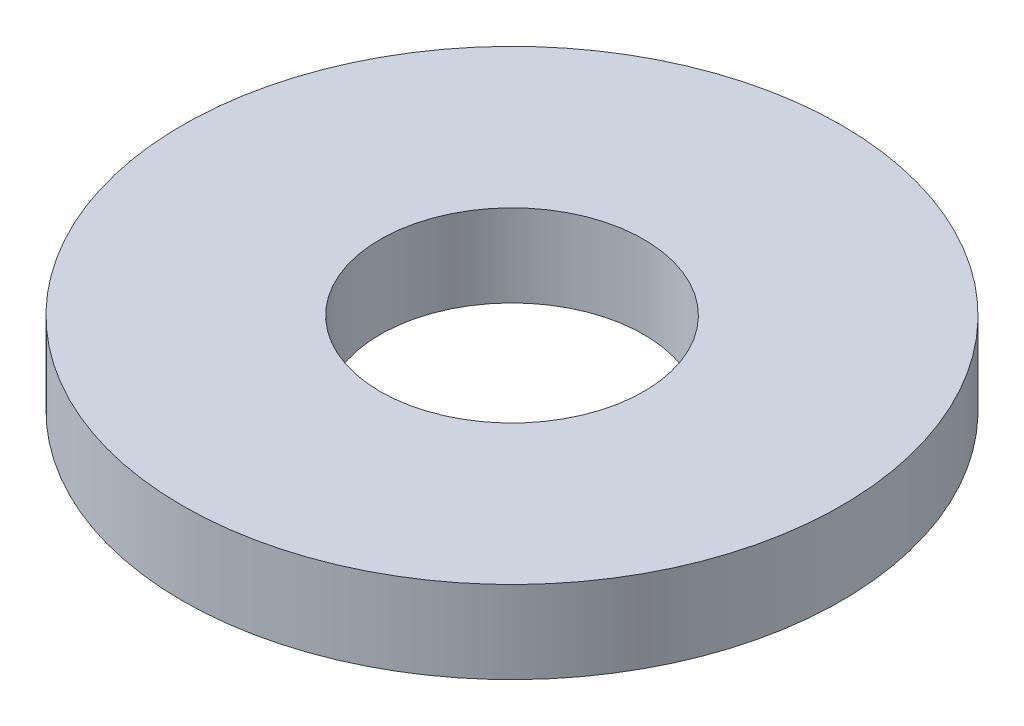
ISO-10303-21;
HEADER;
FILE_DESCRIPTION(('STEP AP214'),'2;1');
FILE_NAME('part.step','',(''),(''),'','','');
FILE_SCHEMA(('AUTOMOTIVE_DESIGN { 1 0 10303 214 1 1 1 1 }'));
ENDSEC;
DATA;
#1=APPLICATION_CONTEXT('core data for automotive mechanical design processes');
#2=APPLICATION_PROTOCOL_DEFINITION('international standard','automotive_design',2000,#1);
#3=PRODUCT_CONTEXT('',#1,'mechanical');
#4=PRODUCT('Part','Part','',(#3));
#5=PRODUCT_RELATED_PRODUCT_CATEGORY('part','',(#4));
#6=PRODUCT_DEFINITION_FORMATION('','',#4);
#7=PRODUCT_DEFINITION_CONTEXT('part definition',#1,'design');
#8=PRODUCT_DEFINITION('design','',#6,#7);
#9=PRODUCT_DEFINITION_SHAPE('','',#8);
#10=(LENGTH_UNIT() NAMED_UNIT(*) SI_UNIT(.MILLI.,.METRE.));
#11=(NAMED_UNIT(*) PLANE_ANGLE_UNIT() SI_UNIT($,.RADIAN.));
#12=(NAMED_UNIT(*) SI_UNIT($,.STERADIAN.) SOLID_ANGLE_UNIT());
#13=UNCERTAINTY_MEASURE_WITH_UNIT(LENGTH_MEASURE(1.E-05),#10,'distance_accuracy_value','');
#14=(GEOMETRIC_REPRESENTATION_CONTEXT(3) GLOBAL_UNCERTAINTY_ASSIGNED_CONTEXT((#13)) GLOBAL_UNIT_ASSIGNED_CONTEXT((#10,
#11,#12)) REPRESENTATION_CONTEXT('',''));
#15=CARTESIAN_POINT('',(0.,0.,0.));
#16=DIRECTION('',(0.,0.,1.));
#17=DIRECTION('',(1.,0.,0.));
#18=AXIS2_PLACEMENT_3D('',#15,#16,#17);
#19=CARTESIAN_POINT('',(0.,1.5875,0.));
#20=DIRECTION('',(0.,1.,0.));
#21=DIRECTION('',(0.,0.,1.));
#22=AXIS2_PLACEMENT_3D('',#19,#20,#21);
#23=PLANE('',#22);
#24=CARTESIAN_POINT('',(0.,1.5875,0.));
#25=DIRECTION('',(0.,1.,0.));
#26=DIRECTION('',(0.,0.,1.));
#27=AXIS2_PLACEMENT_3D('',#24,#25,#26);
#28=CIRCLE('',#27,6.35);
#29=CARTESIAN_POINT('',(0.,1.5875,6.35));
#30=VERTEX_POINT('',#29);
#31=EDGE_CURVE('E10',#30,#30,#28,.T.);
#32=ORIENTED_EDGE('',*,*,#31,.T.);
#33=EDGE_LOOP('',(#32));
#34=FACE_BOUND('',#33,.T.);
#35=CARTESIAN_POINT('',(0.,1.5875,0.));
#36=DIRECTION('',(0.,1.,0.));
#37=DIRECTION('',(0.,0.,1.));
#38=AXIS2_PLACEMENT_3D('',#35,#36,#37);
#39=CIRCLE('',#38,2.54);
#40=CARTESIAN_POINT('',(0.,1.5875,2.54));
#41=VERTEX_POINT('',#40);
#42=EDGE_CURVE('E56',#41,#41,#39,.T.);
#43=ORIENTED_EDGE('',*,*,#42,.F.);
#44=EDGE_LOOP('',(#43));
#45=FACE_BOUND('',#44,.T.);
#46=ADVANCED_FACE('F43',(#34,#45),#23,.T.);
#47=CARTESIAN_POINT('',(0.,0.,0.));
#48=DIRECTION('',(0.,1.,0.));
#49=DIRECTION('',(0.,0.,1.));
#50=AXIS2_PLACEMENT_3D('',#47,#48,#49);
#51=PLANE('',#50);
#52=CARTESIAN_POINT('',(0.,0.,0.));
#53=DIRECTION('',(0.,1.,0.));
#54=DIRECTION('',(0.,0.,1.));
#55=AXIS2_PLACEMENT_3D('',#52,#53,#54);
#56=CIRCLE('',#55,6.35);
#57=CARTESIAN_POINT('',(0.,0.,6.35));
#58=VERTEX_POINT('',#57);
#59=EDGE_CURVE('E47',#58,#58,#56,.T.);
#60=ORIENTED_EDGE('',*,*,#59,.F.);
#61=EDGE_LOOP('',(#60));
#62=FACE_BOUND('',#61,.T.);
#63=CARTESIAN_POINT('',(0.,0.,0.));
#64=DIRECTION('',(0.,1.,0.));
#65=DIRECTION('',(0.,0.,1.));
#66=AXIS2_PLACEMENT_3D('',#63,#64,#65);
#67=CIRCLE('',#66,2.54);
#68=CARTESIAN_POINT('',(0.,0.,2.54));
#69=VERTEX_POINT('',#68);
#70=EDGE_CURVE('E58',#69,#69,#67,.T.);
#71=ORIENTED_EDGE('',*,*,#70,.T.);
#72=EDGE_LOOP('',(#71));
#73=FACE_BOUND('',#72,.T.);
#74=ADVANCED_FACE('F70',(#62,#73),#51,.F.);
#75=CARTESIAN_POINT('',(0.,1.5875,0.));
#76=DIRECTION('',(0.,-1.,0.));
#77=DIRECTION('',(0.,0.,-1.));
#78=AXIS2_PLACEMENT_3D('',#75,#76,#77);
#79=CYLINDRICAL_SURFACE('',#78,6.35);
#80=ORIENTED_EDGE('',*,*,#31,.F.);
#81=EDGE_LOOP('',(#80));
#82=FACE_BOUND('',#81,.T.);
#83=ORIENTED_EDGE('',*,*,#59,.T.);
#84=EDGE_LOOP('',(#83));
#85=FACE_BOUND('',#84,.T.);
#86=ADVANCED_FACE('F45',(#82,#85),#79,.T.);
#87=CARTESIAN_POINT('',(0.,1.5875,0.));
#88=DIRECTION('',(0.,-1.,0.));
#89=DIRECTION('',(0.,0.,-1.));
#90=AXIS2_PLACEMENT_3D('',#87,#88,#89);
#91=CYLINDRICAL_SURFACE('',#90,2.54);
#92=ORIENTED_EDGE('',*,*,#42,.T.);
#93=EDGE_LOOP('',(#92));
#94=FACE_BOUND('',#93,.T.);
#95=ORIENTED_EDGE('',*,*,#70,.F.);
#96=EDGE_LOOP('',(#95));
#97=FACE_BOUND('',#96,.T.);
#98=ADVANCED_FACE('F66',(#94,#97),#91,.F.);
#99=CLOSED_SHELL('',(#46,#74,#86,#98));
#100=MANIFOLD_SOLID_BREP('B2',#99);
#101=ADVANCED_BREP_SHAPE_REPRESENTATION('',(#18,#100),#14);
#102=SHAPE_DEFINITION_REPRESENTATION(#9,#101);
ENDSEC;
END-ISO-10303-21;
